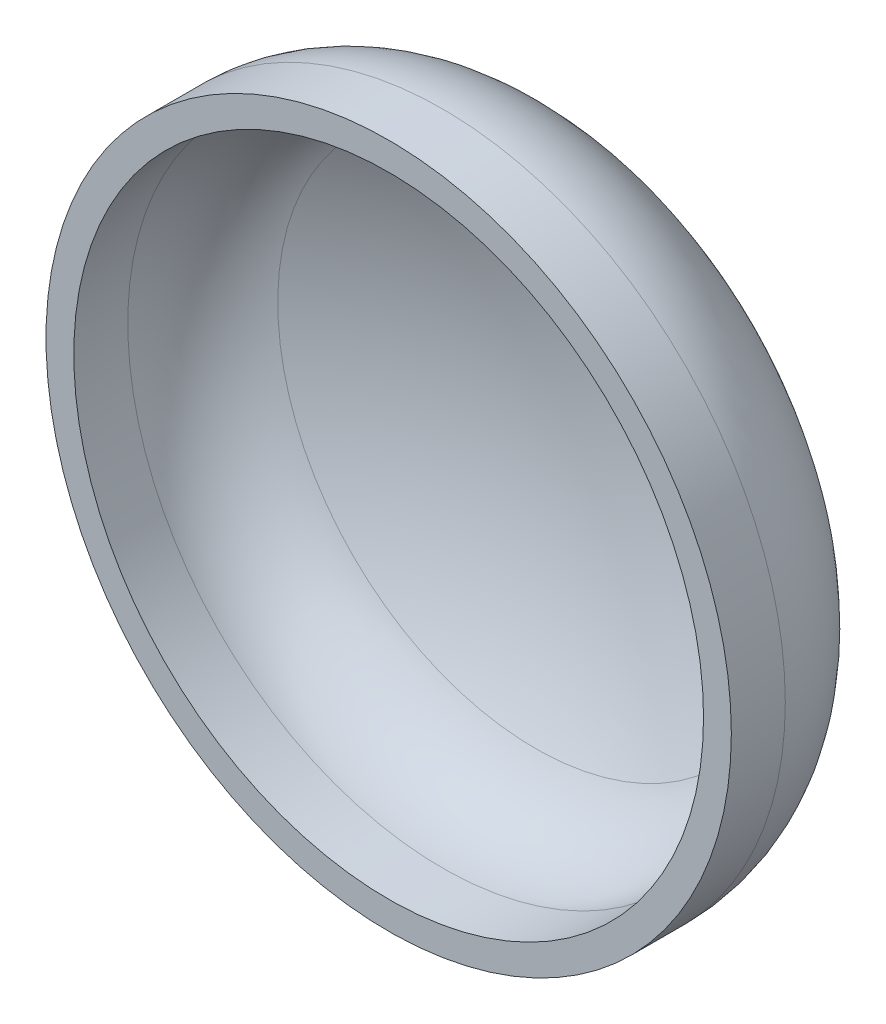
ISO-10303-21;
HEADER;
FILE_DESCRIPTION(('STEP AP214'),'2;1');
FILE_NAME('part.step','',(''),(''),'','','');
FILE_SCHEMA(('AUTOMOTIVE_DESIGN { 1 0 10303 214 1 1 1 1 }'));
ENDSEC;
DATA;
#1=APPLICATION_CONTEXT('core data for automotive mechanical design processes');
#2=APPLICATION_PROTOCOL_DEFINITION('international standard','automotive_design',2000,#1);
#3=PRODUCT_CONTEXT('',#1,'mechanical');
#4=PRODUCT('Part','Part','',(#3));
#5=PRODUCT_RELATED_PRODUCT_CATEGORY('part','',(#4));
#6=PRODUCT_DEFINITION_FORMATION('','',#4);
#7=PRODUCT_DEFINITION_CONTEXT('part definition',#1,'design');
#8=PRODUCT_DEFINITION('design','',#6,#7);
#9=PRODUCT_DEFINITION_SHAPE('','',#8);
#10=(LENGTH_UNIT() NAMED_UNIT(*) SI_UNIT(.MILLI.,.METRE.));
#11=(NAMED_UNIT(*) PLANE_ANGLE_UNIT() SI_UNIT($,.RADIAN.));
#12=(NAMED_UNIT(*) SI_UNIT($,.STERADIAN.) SOLID_ANGLE_UNIT());
#13=UNCERTAINTY_MEASURE_WITH_UNIT(LENGTH_MEASURE(1.E-05),#10,'distance_accuracy_value','');
#14=(GEOMETRIC_REPRESENTATION_CONTEXT(3) GLOBAL_UNCERTAINTY_ASSIGNED_CONTEXT((#13)) GLOBAL_UNIT_ASSIGNED_CONTEXT((#10,
#11,#12)) REPRESENTATION_CONTEXT('',''));
#15=CARTESIAN_POINT('',(0.,0.,0.));
#16=DIRECTION('',(0.,0.,1.));
#17=DIRECTION('',(1.,0.,0.));
#18=AXIS2_PLACEMENT_3D('',#15,#16,#17);
#19=CARTESIAN_POINT('',(0.,254.,0.));
#20=DIRECTION('',(0.,0.,-1.));
#21=DIRECTION('',(-1.,0.,0.));
#22=AXIS2_PLACEMENT_3D('',#19,#20,#21);
#23=PLANE('',#22);
#24=CARTESIAN_POINT('',(0.,0.,0.));
#25=DIRECTION('',(0.,0.,1.));
#26=DIRECTION('',(1.,0.,0.));
#27=AXIS2_PLACEMENT_3D('',#24,#25,#26);
#28=CIRCLE('',#27,233.4);
#29=CARTESIAN_POINT('',(233.4,0.,0.));
#30=VERTEX_POINT('',#29);
#31=EDGE_CURVE('E53',#30,#30,#28,.T.);
#32=ORIENTED_EDGE('',*,*,#31,.F.);
#33=EDGE_LOOP('',(#32));
#34=FACE_BOUND('',#33,.T.);
#35=CARTESIAN_POINT('',(0.,0.,0.));
#36=DIRECTION('',(0.,0.,1.));
#37=DIRECTION('',(1.,0.,0.));
#38=AXIS2_PLACEMENT_3D('',#35,#36,#37);
#39=CIRCLE('',#38,254.);
#40=CARTESIAN_POINT('',(254.,0.,0.));
#41=VERTEX_POINT('',#40);
#42=EDGE_CURVE('E10',#41,#41,#39,.T.);
#43=ORIENTED_EDGE('',*,*,#42,.T.);
#44=EDGE_LOOP('',(#43));
#45=FACE_BOUND('',#44,.T.);
#46=ADVANCED_FACE('F31',(#34,#45),#23,.F.);
#47=CARTESIAN_POINT('',(0.,0.,0.));
#48=DIRECTION('',(0.,0.,1.));
#49=DIRECTION('',(1.,0.,0.));
#50=AXIS2_PLACEMENT_3D('',#47,#48,#49);
#51=CYLINDRICAL_SURFACE('',#50,254.);
#52=ORIENTED_EDGE('',*,*,#42,.F.);
#53=EDGE_LOOP('',(#52));
#54=FACE_BOUND('',#53,.T.);
#55=CARTESIAN_POINT('',(0.,0.,-40.));
#56=DIRECTION('',(0.,0.,1.));
#57=DIRECTION('',(1.,0.,0.));
#58=AXIS2_PLACEMENT_3D('',#55,#56,#57);
#59=CIRCLE('',#58,254.);
#60=CARTESIAN_POINT('',(254.,0.,-40.));
#61=VERTEX_POINT('',#60);
#62=EDGE_CURVE('E37',#61,#61,#59,.T.);
#63=ORIENTED_EDGE('',*,*,#62,.T.);
#64=EDGE_LOOP('',(#63));
#65=FACE_BOUND('',#64,.T.);
#66=ADVANCED_FACE('F60',(#54,#65),#51,.T.);
#67=CARTESIAN_POINT('',(0.,0.,-40.));
#68=DIRECTION('',(0.,0.,1.));
#69=DIRECTION('',(1.,0.,0.));
#70=AXIS2_PLACEMENT_3D('',#67,#68,#69);
#71=TOROIDAL_SURFACE('',#70,156.4,97.6000000000001);
#72=ORIENTED_EDGE('',*,*,#62,.F.);
#73=EDGE_LOOP('',(#72));
#74=FACE_BOUND('',#73,.T.);
#75=CARTESIAN_POINT('',(0.,0.,-127.187829259215));
#76=DIRECTION('',(0.,0.,1.));
#77=DIRECTION('',(1.,0.,0.));
#78=AXIS2_PLACEMENT_3D('',#75,#76,#77);
#79=CIRCLE('',#78,200.263908045977);
#80=CARTESIAN_POINT('',(200.263908045977,0.,-127.187829259215));
#81=VERTEX_POINT('',#80);
#82=EDGE_CURVE('E41',#81,#81,#79,.T.);
#83=ORIENTED_EDGE('',*,*,#82,.T.);
#84=EDGE_LOOP('',(#83));
#85=FACE_BOUND('',#84,.T.);
#86=ADVANCED_FACE('F64',(#74,#85),#71,.T.);
#87=CARTESIAN_POINT('',(0.,0.,270.874637112776));
#88=DIRECTION('',(0.,0.,1.));
#89=DIRECTION('',(0.,1.,0.));
#90=AXIS2_PLACEMENT_3D('',#87,#88,#89);
#91=SPHERICAL_SURFACE('',#90,445.6);
#92=ORIENTED_EDGE('',*,*,#82,.F.);
#93=EDGE_LOOP('',(#92));
#94=FACE_BOUND('',#93,.T.);
#95=ADVANCED_FACE('F69',(#94),#91,.T.);
#96=CARTESIAN_POINT('',(0.,0.,270.874637112776));
#97=DIRECTION('',(0.,0.,1.));
#98=DIRECTION('',(0.,1.,0.));
#99=AXIS2_PLACEMENT_3D('',#96,#97,#98);
#100=SPHERICAL_SURFACE('',#99,425.);
#101=CARTESIAN_POINT('',(0.,0.,-108.785480050815));
#102=DIRECTION('',(0.,0.,1.));
#103=DIRECTION('',(1.,0.,0.));
#104=AXIS2_PLACEMENT_3D('',#101,#102,#103);
#105=CIRCLE('',#104,191.005747126437);
#106=CARTESIAN_POINT('',(191.005747126437,0.,-108.785480050815));
#107=VERTEX_POINT('',#106);
#108=EDGE_CURVE('E45',#107,#107,#105,.T.);
#109=ORIENTED_EDGE('',*,*,#108,.T.);
#110=EDGE_LOOP('',(#109));
#111=FACE_BOUND('',#110,.T.);
#112=ADVANCED_FACE('F75',(#111),#100,.F.);
#113=CARTESIAN_POINT('',(0.,0.,-40.));
#114=DIRECTION('',(0.,0.,1.));
#115=DIRECTION('',(1.,0.,0.));
#116=AXIS2_PLACEMENT_3D('',#113,#114,#115);
#117=TOROIDAL_SURFACE('',#116,156.4,77.);
#118=ORIENTED_EDGE('',*,*,#108,.F.);
#119=EDGE_LOOP('',(#118));
#120=FACE_BOUND('',#119,.T.);
#121=CARTESIAN_POINT('',(0.,0.,-40.));
#122=DIRECTION('',(0.,0.,1.));
#123=DIRECTION('',(1.,0.,0.));
#124=AXIS2_PLACEMENT_3D('',#121,#122,#123);
#125=CIRCLE('',#124,233.4);
#126=CARTESIAN_POINT('',(233.4,0.,-40.));
#127=VERTEX_POINT('',#126);
#128=EDGE_CURVE('E50',#127,#127,#125,.T.);
#129=ORIENTED_EDGE('',*,*,#128,.T.);
#130=EDGE_LOOP('',(#129));
#131=FACE_BOUND('',#130,.T.);
#132=ADVANCED_FACE('F79',(#120,#131),#117,.F.);
#133=CARTESIAN_POINT('',(0.,0.,0.));
#134=DIRECTION('',(0.,0.,1.));
#135=DIRECTION('',(1.,0.,0.));
#136=AXIS2_PLACEMENT_3D('',#133,#134,#135);
#137=CYLINDRICAL_SURFACE('',#136,233.4);
#138=ORIENTED_EDGE('',*,*,#128,.F.);
#139=EDGE_LOOP('',(#138));
#140=FACE_BOUND('',#139,.T.);
#141=ORIENTED_EDGE('',*,*,#31,.T.);
#142=EDGE_LOOP('',(#141));
#143=FACE_BOUND('',#142,.T.);
#144=ADVANCED_FACE('F57',(#140,#143),#137,.F.);
#145=CLOSED_SHELL('',(#46,#66,#86,#95,#112,#132,#144));
#146=MANIFOLD_SOLID_BREP('B2',#145);
#147=ADVANCED_BREP_SHAPE_REPRESENTATION('',(#18,#146),#14);
#148=SHAPE_DEFINITION_REPRESENTATION(#9,#147);
ENDSEC;
END-ISO-10303-21;
